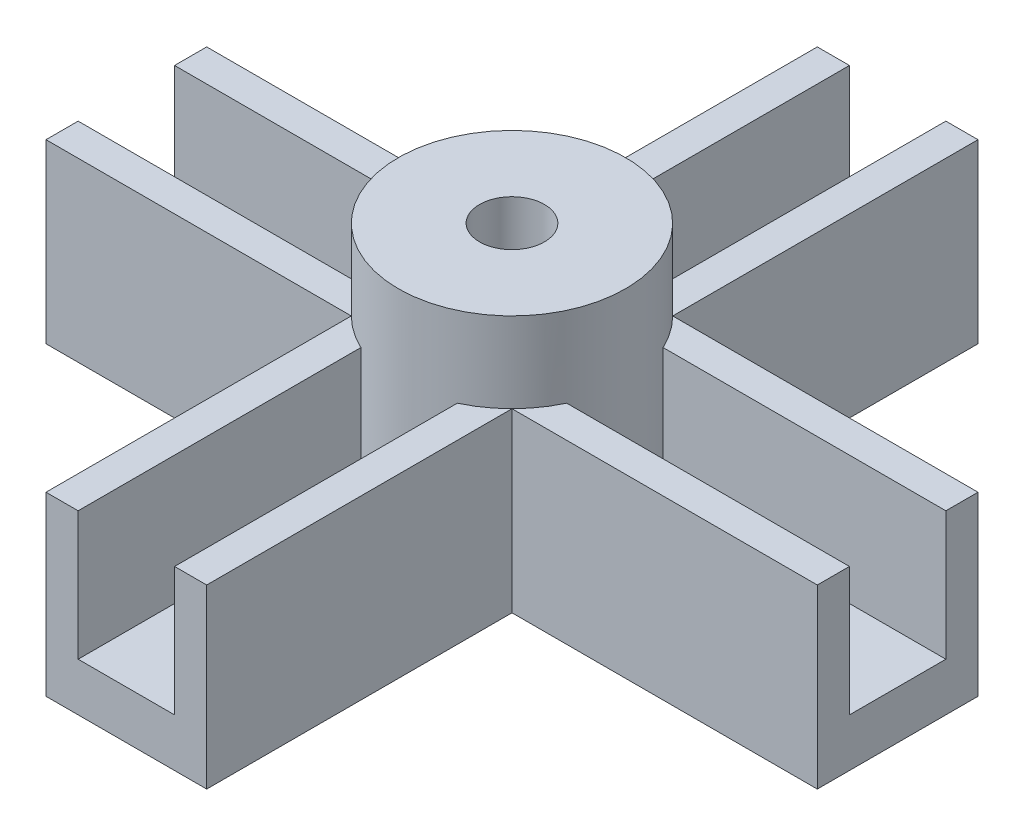
ISO-10303-21;
HEADER;
FILE_DESCRIPTION(('STEP AP214'),'2;1');
FILE_NAME('part.step','',(''),(''),'','','');
FILE_SCHEMA(('AUTOMOTIVE_DESIGN { 1 0 10303 214 1 1 1 1 }'));
ENDSEC;
DATA;
#1=APPLICATION_CONTEXT('core data for automotive mechanical design processes');
#2=APPLICATION_PROTOCOL_DEFINITION('international standard','automotive_design',2000,#1);
#3=PRODUCT_CONTEXT('',#1,'mechanical');
#4=PRODUCT('Part','Part','',(#3));
#5=PRODUCT_RELATED_PRODUCT_CATEGORY('part','',(#4));
#6=PRODUCT_DEFINITION_FORMATION('','',#4);
#7=PRODUCT_DEFINITION_CONTEXT('part definition',#1,'design');
#8=PRODUCT_DEFINITION('design','',#6,#7);
#9=PRODUCT_DEFINITION_SHAPE('','',#8);
#10=(LENGTH_UNIT() NAMED_UNIT(*) SI_UNIT(.MILLI.,.METRE.));
#11=(NAMED_UNIT(*) PLANE_ANGLE_UNIT() SI_UNIT($,.RADIAN.));
#12=(NAMED_UNIT(*) SI_UNIT($,.STERADIAN.) SOLID_ANGLE_UNIT());
#13=UNCERTAINTY_MEASURE_WITH_UNIT(LENGTH_MEASURE(1.E-05),#10,'distance_accuracy_value','');
#14=(GEOMETRIC_REPRESENTATION_CONTEXT(3) GLOBAL_UNCERTAINTY_ASSIGNED_CONTEXT((#13)) GLOBAL_UNIT_ASSIGNED_CONTEXT((#10,
#11,#12)) REPRESENTATION_CONTEXT('',''));
#15=CARTESIAN_POINT('',(0.,0.,0.));
#16=DIRECTION('',(0.,0.,1.));
#17=DIRECTION('',(1.,0.,0.));
#18=AXIS2_PLACEMENT_3D('',#15,#16,#17);
#19=CARTESIAN_POINT('',(0.,40.5305358690022,0.));
#20=DIRECTION('',(0.,-1.,0.));
#21=DIRECTION('',(0.,0.,-1.));
#22=AXIS2_PLACEMENT_3D('',#19,#20,#21);
#23=CYLINDRICAL_SURFACE('',#22,17.6776695296637);
#24=CARTESIAN_POINT('',(0.,40.,0.));
#25=DIRECTION('',(0.,1.,0.));
#26=DIRECTION('',(0.,0.,1.));
#27=AXIS2_PLACEMENT_3D('',#24,#25,#26);
#28=CIRCLE('',#27,17.6776695296637);
#29=CARTESIAN_POINT('',(0.,40.,17.6776695296637));
#30=VERTEX_POINT('',#29);
#31=EDGE_CURVE('E443',#30,#30,#28,.T.);
#32=ORIENTED_EDGE('',*,*,#31,.F.);
#33=EDGE_LOOP('',(#32));
#34=FACE_BOUND('',#33,.T.);
#35=CARTESIAN_POINT('',(0.,7.5,0.));
#36=DIRECTION('',(0.,1.,0.));
#37=DIRECTION('',(0.,0.,1.));
#38=AXIS2_PLACEMENT_3D('',#35,#36,#37);
#39=CIRCLE('',#38,17.6776695296637);
#40=CARTESIAN_POINT('',(-16.0078105935821,7.5,-7.49999999999998));
#41=VERTEX_POINT('',#40);
#42=CARTESIAN_POINT('',(-16.0078105935821,7.5,7.49999999999998));
#43=VERTEX_POINT('',#42);
#44=EDGE_CURVE('E300',#41,#43,#39,.T.);
#45=ORIENTED_EDGE('',*,*,#44,.T.);
#46=DIRECTION('',(0.,-1.,0.));
#47=VECTOR('',#46,1.);
#48=CARTESIAN_POINT('',(-16.0078105935821,27.5,7.49999999999998));
#49=LINE('',#48,#47);
#50=CARTESIAN_POINT('',(-16.0078105935821,27.5,7.49999999999998));
#51=VERTEX_POINT('',#50);
#52=EDGE_CURVE('E284',#51,#43,#49,.T.);
#53=ORIENTED_EDGE('',*,*,#52,.F.);
#54=CARTESIAN_POINT('',(0.,27.5,0.));
#55=DIRECTION('',(0.,1.,0.));
#56=DIRECTION('',(0.,0.,1.));
#57=AXIS2_PLACEMENT_3D('',#54,#55,#56);
#58=CIRCLE('',#57,17.6776695296637);
#59=CARTESIAN_POINT('',(-12.5,27.5,12.5));
#60=VERTEX_POINT('',#59);
#61=EDGE_CURVE('E304',#60,#51,#58,.F.);
#62=ORIENTED_EDGE('',*,*,#61,.F.);
#63=CARTESIAN_POINT('',(0.,27.5,0.));
#64=DIRECTION('',(0.,1.,0.));
#65=DIRECTION('',(0.,0.,1.));
#66=AXIS2_PLACEMENT_3D('',#63,#64,#65);
#67=CIRCLE('',#66,17.6776695296637);
#68=CARTESIAN_POINT('',(-7.49999999999999,27.5,16.0078105935821));
#69=VERTEX_POINT('',#68);
#70=EDGE_CURVE('E608',#60,#69,#67,.T.);
#71=ORIENTED_EDGE('',*,*,#70,.T.);
#72=DIRECTION('',(0.,-1.,0.));
#73=VECTOR('',#72,1.);
#74=CARTESIAN_POINT('',(-7.49999999999999,27.5,16.0078105935821));
#75=LINE('',#74,#73);
#76=CARTESIAN_POINT('',(-7.49999999999999,7.5,16.0078105935821));
#77=VERTEX_POINT('',#76);
#78=EDGE_CURVE('E601',#69,#77,#75,.T.);
#79=ORIENTED_EDGE('',*,*,#78,.T.);
#80=CARTESIAN_POINT('',(0.,7.5,0.));
#81=DIRECTION('',(0.,1.,0.));
#82=DIRECTION('',(0.,0.,1.));
#83=AXIS2_PLACEMENT_3D('',#80,#81,#82);
#84=CIRCLE('',#83,17.6776695296637);
#85=CARTESIAN_POINT('',(7.49999999999988,7.5,16.0078105935822));
#86=VERTEX_POINT('',#85);
#87=EDGE_CURVE('E389',#77,#86,#84,.T.);
#88=ORIENTED_EDGE('',*,*,#87,.T.);
#89=DIRECTION('',(0.,-1.,0.));
#90=VECTOR('',#89,1.);
#91=CARTESIAN_POINT('',(7.49999999999988,27.5,16.0078105935821));
#92=LINE('',#91,#90);
#93=CARTESIAN_POINT('',(7.49999999999989,27.5,16.0078105935821));
#94=VERTEX_POINT('',#93);
#95=EDGE_CURVE('E119',#94,#86,#92,.T.);
#96=ORIENTED_EDGE('',*,*,#95,.F.);
#97=CARTESIAN_POINT('',(0.,27.5,0.));
#98=DIRECTION('',(0.,1.,0.));
#99=DIRECTION('',(0.,0.,1.));
#100=AXIS2_PLACEMENT_3D('',#97,#98,#99);
#101=CIRCLE('',#100,17.6776695296637);
#102=CARTESIAN_POINT('',(12.5,27.5,12.5));
#103=VERTEX_POINT('',#102);
#104=EDGE_CURVE('E575',#94,#103,#101,.T.);
#105=ORIENTED_EDGE('',*,*,#104,.T.);
#106=CARTESIAN_POINT('',(0.,27.5,0.));
#107=DIRECTION('',(0.,1.,0.));
#108=DIRECTION('',(0.,0.,1.));
#109=AXIS2_PLACEMENT_3D('',#106,#107,#108);
#110=CIRCLE('',#109,17.6776695296637);
#111=CARTESIAN_POINT('',(16.0078105935821,27.5,7.49999999999998));
#112=VERTEX_POINT('',#111);
#113=EDGE_CURVE('E563',#103,#112,#110,.T.);
#114=ORIENTED_EDGE('',*,*,#113,.T.);
#115=DIRECTION('',(0.,-1.,0.));
#116=VECTOR('',#115,1.);
#117=CARTESIAN_POINT('',(16.0078105935821,27.5,7.49999999999998));
#118=LINE('',#117,#116);
#119=CARTESIAN_POINT('',(16.0078105935821,7.5,7.49999999999998));
#120=VERTEX_POINT('',#119);
#121=EDGE_CURVE('E555',#112,#120,#118,.T.);
#122=ORIENTED_EDGE('',*,*,#121,.T.);
#123=CARTESIAN_POINT('',(0.,7.5,0.));
#124=DIRECTION('',(0.,1.,0.));
#125=DIRECTION('',(0.,0.,1.));
#126=AXIS2_PLACEMENT_3D('',#123,#124,#125);
#127=CIRCLE('',#126,17.6776695296637);
#128=CARTESIAN_POINT('',(16.0078105935821,7.5,-7.49999999999998));
#129=VERTEX_POINT('',#128);
#130=EDGE_CURVE('E332',#120,#129,#127,.T.);
#131=ORIENTED_EDGE('',*,*,#130,.T.);
#132=DIRECTION('',(0.,-1.,0.));
#133=VECTOR('',#132,1.);
#134=CARTESIAN_POINT('',(16.0078105935821,27.5,-7.49999999999998));
#135=LINE('',#134,#133);
#136=CARTESIAN_POINT('',(16.0078105935821,27.5,-7.49999999999998));
#137=VERTEX_POINT('',#136);
#138=EDGE_CURVE('E537',#137,#129,#135,.T.);
#139=ORIENTED_EDGE('',*,*,#138,.F.);
#140=CARTESIAN_POINT('',(0.,27.5,0.));
#141=DIRECTION('',(0.,1.,0.));
#142=DIRECTION('',(0.,0.,1.));
#143=AXIS2_PLACEMENT_3D('',#140,#141,#142);
#144=CIRCLE('',#143,17.6776695296637);
#145=CARTESIAN_POINT('',(12.5,27.5,-12.5));
#146=VERTEX_POINT('',#145);
#147=EDGE_CURVE('E528',#137,#146,#144,.T.);
#148=ORIENTED_EDGE('',*,*,#147,.T.);
#149=CARTESIAN_POINT('',(0.,27.5,0.));
#150=DIRECTION('',(0.,1.,0.));
#151=DIRECTION('',(0.,0.,1.));
#152=AXIS2_PLACEMENT_3D('',#149,#150,#151);
#153=CIRCLE('',#152,17.6776695296637);
#154=CARTESIAN_POINT('',(7.49999999999988,27.5,-16.0078105935821));
#155=VERTEX_POINT('',#154);
#156=EDGE_CURVE('E514',#146,#155,#153,.T.);
#157=ORIENTED_EDGE('',*,*,#156,.T.);
#158=DIRECTION('',(0.,-1.,0.));
#159=VECTOR('',#158,1.);
#160=CARTESIAN_POINT('',(7.49999999999988,27.5,-16.0078105935821));
#161=LINE('',#160,#159);
#162=CARTESIAN_POINT('',(7.49999999999988,7.5,-16.0078105935821));
#163=VERTEX_POINT('',#162);
#164=EDGE_CURVE('E506',#155,#163,#161,.T.);
#165=ORIENTED_EDGE('',*,*,#164,.T.);
#166=CARTESIAN_POINT('',(0.,7.5,0.));
#167=DIRECTION('',(0.,1.,0.));
#168=DIRECTION('',(0.,0.,1.));
#169=AXIS2_PLACEMENT_3D('',#166,#167,#168);
#170=CIRCLE('',#169,17.6776695296637);
#171=CARTESIAN_POINT('',(-7.49999999999999,7.5,-16.0078105935821));
#172=VERTEX_POINT('',#171);
#173=EDGE_CURVE('E437',#163,#172,#170,.T.);
#174=ORIENTED_EDGE('',*,*,#173,.T.);
#175=DIRECTION('',(0.,-1.,0.));
#176=VECTOR('',#175,1.);
#177=CARTESIAN_POINT('',(-7.49999999999999,27.5,-16.0078105935821));
#178=LINE('',#177,#176);
#179=CARTESIAN_POINT('',(-7.49999999999999,27.5,-16.0078105935821));
#180=VERTEX_POINT('',#179);
#181=EDGE_CURVE('E486',#180,#172,#178,.T.);
#182=ORIENTED_EDGE('',*,*,#181,.F.);
#183=CARTESIAN_POINT('',(0.,27.5,0.));
#184=DIRECTION('',(0.,1.,0.));
#185=DIRECTION('',(0.,0.,1.));
#186=AXIS2_PLACEMENT_3D('',#183,#184,#185);
#187=CIRCLE('',#186,17.6776695296637);
#188=CARTESIAN_POINT('',(-12.5,27.5,-12.5));
#189=VERTEX_POINT('',#188);
#190=EDGE_CURVE('E477',#180,#189,#187,.T.);
#191=ORIENTED_EDGE('',*,*,#190,.T.);
#192=CARTESIAN_POINT('',(0.,27.5,0.));
#193=DIRECTION('',(0.,1.,0.));
#194=DIRECTION('',(0.,0.,1.));
#195=AXIS2_PLACEMENT_3D('',#192,#193,#194);
#196=CIRCLE('',#195,17.6776695296637);
#197=CARTESIAN_POINT('',(-16.0078105935821,27.5,-7.49999999999998));
#198=VERTEX_POINT('',#197);
#199=EDGE_CURVE('E467',#198,#189,#196,.F.);
#200=ORIENTED_EDGE('',*,*,#199,.F.);
#201=DIRECTION('',(0.,-1.,0.));
#202=VECTOR('',#201,1.);
#203=CARTESIAN_POINT('',(-16.0078105935821,27.5,-7.49999999999998));
#204=LINE('',#203,#202);
#205=EDGE_CURVE('E309',#198,#41,#204,.T.);
#206=ORIENTED_EDGE('',*,*,#205,.T.);
#207=EDGE_LOOP('',(#45,#53,#62,#71,#79,#88,#96,#105,#114,#122,#131,#139,#148,#157,#165,#174,
#182,#191,#200,#206));
#208=FACE_BOUND('',#207,.T.);
#209=ADVANCED_FACE('F95',(#34,#208),#23,.T.);
#210=CARTESIAN_POINT('',(0.,7.5,0.));
#211=DIRECTION('',(0.,1.,0.));
#212=DIRECTION('',(0.,0.,1.));
#213=AXIS2_PLACEMENT_3D('',#210,#211,#212);
#214=PLANE('',#213);
#215=ORIENTED_EDGE('',*,*,#87,.F.);
#216=DIRECTION('',(0.,0.,-1.));
#217=VECTOR('',#216,1.);
#218=CARTESIAN_POINT('',(-7.49999999999998,7.5,0.));
#219=LINE('',#218,#217);
#220=CARTESIAN_POINT('',(-7.49999999999999,7.5,60.));
#221=VERTEX_POINT('',#220);
#222=EDGE_CURVE('E303',#221,#77,#219,.T.);
#223=ORIENTED_EDGE('',*,*,#222,.F.);
#224=DIRECTION('',(1.,0.,0.));
#225=VECTOR('',#224,1.);
#226=CARTESIAN_POINT('',(0.,7.5,60.));
#227=LINE('',#226,#225);
#228=CARTESIAN_POINT('',(7.49999999999973,7.5,60.));
#229=VERTEX_POINT('',#228);
#230=EDGE_CURVE('E394',#221,#229,#227,.T.);
#231=ORIENTED_EDGE('',*,*,#230,.T.);
#232=DIRECTION('',(0.,0.,-1.));
#233=VECTOR('',#232,1.);
#234=CARTESIAN_POINT('',(7.49999999999999,7.5,0.));
#235=LINE('',#234,#233);
#236=EDGE_CURVE('E564',#229,#86,#235,.T.);
#237=ORIENTED_EDGE('',*,*,#236,.T.);
#238=EDGE_LOOP('',(#215,#223,#231,#237));
#239=FACE_BOUND('',#238,.T.);
#240=ADVANCED_FACE('F653',(#239),#214,.T.);
#241=CARTESIAN_POINT('',(0.,7.5,0.));
#242=DIRECTION('',(0.,1.,0.));
#243=DIRECTION('',(0.,0.,1.));
#244=AXIS2_PLACEMENT_3D('',#241,#242,#243);
#245=PLANE('',#244);
#246=ORIENTED_EDGE('',*,*,#130,.F.);
#247=DIRECTION('',(-1.,0.,0.));
#248=VECTOR('',#247,1.);
#249=CARTESIAN_POINT('',(0.,7.5,7.49999999999982));
#250=LINE('',#249,#248);
#251=CARTESIAN_POINT('',(60.,7.5,7.5000000000002));
#252=VERTEX_POINT('',#251);
#253=EDGE_CURVE('E560',#252,#120,#250,.T.);
#254=ORIENTED_EDGE('',*,*,#253,.F.);
#255=DIRECTION('',(0.,0.,-1.));
#256=VECTOR('',#255,1.);
#257=CARTESIAN_POINT('',(60.,7.5,0.));
#258=LINE('',#257,#256);
#259=CARTESIAN_POINT('',(60.,7.5,-7.5000000000002));
#260=VERTEX_POINT('',#259);
#261=EDGE_CURVE('E335',#252,#260,#258,.T.);
#262=ORIENTED_EDGE('',*,*,#261,.T.);
#263=DIRECTION('',(-1.,0.,0.));
#264=VECTOR('',#263,1.);
#265=CARTESIAN_POINT('',(0.,7.5,-7.49999999999982));
#266=LINE('',#265,#264);
#267=EDGE_CURVE('E515',#260,#129,#266,.T.);
#268=ORIENTED_EDGE('',*,*,#267,.T.);
#269=EDGE_LOOP('',(#246,#254,#262,#268));
#270=FACE_BOUND('',#269,.T.);
#271=ADVANCED_FACE('F658',(#270),#245,.T.);
#272=CARTESIAN_POINT('',(0.,7.5,0.));
#273=DIRECTION('',(0.,1.,0.));
#274=DIRECTION('',(0.,0.,1.));
#275=AXIS2_PLACEMENT_3D('',#272,#273,#274);
#276=PLANE('',#275);
#277=ORIENTED_EDGE('',*,*,#173,.F.);
#278=DIRECTION('',(0.,0.,1.));
#279=VECTOR('',#278,1.);
#280=CARTESIAN_POINT('',(7.49999999999999,7.5,0.));
#281=LINE('',#280,#279);
#282=CARTESIAN_POINT('',(7.49999999999973,7.5,-60.));
#283=VERTEX_POINT('',#282);
#284=EDGE_CURVE('E511',#283,#163,#281,.T.);
#285=ORIENTED_EDGE('',*,*,#284,.F.);
#286=DIRECTION('',(1.,0.,0.));
#287=VECTOR('',#286,1.);
#288=CARTESIAN_POINT('',(0.,7.5,-60.));
#289=LINE('',#288,#287);
#290=CARTESIAN_POINT('',(-7.49999999999999,7.5,-60.));
#291=VERTEX_POINT('',#290);
#292=EDGE_CURVE('E432',#291,#283,#289,.T.);
#293=ORIENTED_EDGE('',*,*,#292,.F.);
#294=DIRECTION('',(0.,0.,1.));
#295=VECTOR('',#294,1.);
#296=CARTESIAN_POINT('',(-7.49999999999998,7.5,0.));
#297=LINE('',#296,#295);
#298=EDGE_CURVE('E463',#291,#172,#297,.T.);
#299=ORIENTED_EDGE('',*,*,#298,.T.);
#300=EDGE_LOOP('',(#277,#285,#293,#299));
#301=FACE_BOUND('',#300,.T.);
#302=ADVANCED_FACE('F667',(#301),#276,.T.);
#303=CARTESIAN_POINT('',(0.,7.5,0.));
#304=DIRECTION('',(0.,1.,0.));
#305=DIRECTION('',(0.,0.,1.));
#306=AXIS2_PLACEMENT_3D('',#303,#304,#305);
#307=PLANE('',#306);
#308=DIRECTION('',(1.,0.,0.));
#309=VECTOR('',#308,1.);
#310=CARTESIAN_POINT('',(0.,7.5,7.49999999999998));
#311=LINE('',#310,#309);
#312=CARTESIAN_POINT('',(-60.,7.5,7.49999999999998));
#313=VERTEX_POINT('',#312);
#314=EDGE_CURVE('E287',#313,#43,#311,.T.);
#315=ORIENTED_EDGE('',*,*,#314,.T.);
#316=ORIENTED_EDGE('',*,*,#44,.F.);
#317=DIRECTION('',(1.,0.,0.));
#318=VECTOR('',#317,1.);
#319=CARTESIAN_POINT('',(0.,7.5,-7.49999999999998));
#320=LINE('',#319,#318);
#321=CARTESIAN_POINT('',(-60.,7.5,-7.49999999999998));
#322=VERTEX_POINT('',#321);
#323=EDGE_CURVE('E459',#322,#41,#320,.T.);
#324=ORIENTED_EDGE('',*,*,#323,.F.);
#325=DIRECTION('',(0.,0.,-1.));
#326=VECTOR('',#325,1.);
#327=CARTESIAN_POINT('',(-60.,7.5,0.));
#328=LINE('',#327,#326);
#329=EDGE_CURVE('E301',#313,#322,#328,.T.);
#330=ORIENTED_EDGE('',*,*,#329,.F.);
#331=EDGE_LOOP('',(#315,#316,#324,#330));
#332=FACE_BOUND('',#331,.T.);
#333=ADVANCED_FACE('F298',(#332),#307,.T.);
#334=CARTESIAN_POINT('',(0.,7.5,-12.5));
#335=DIRECTION('',(0.,0.,-1.));
#336=DIRECTION('',(-1.,0.,0.));
#337=AXIS2_PLACEMENT_3D('',#334,#335,#336);
#338=PLANE('',#337);
#339=DIRECTION('',(1.,0.,0.));
#340=VECTOR('',#339,1.);
#341=CARTESIAN_POINT('',(0.,0.,-12.5));
#342=LINE('',#341,#340);
#343=CARTESIAN_POINT('',(12.5,0.,-12.5));
#344=VERTEX_POINT('',#343);
#345=CARTESIAN_POINT('',(60.,0.,-12.5));
#346=VERTEX_POINT('',#345);
#347=EDGE_CURVE('E346',#344,#346,#342,.T.);
#348=ORIENTED_EDGE('',*,*,#347,.F.);
#349=DIRECTION('',(0.,-1.,0.));
#350=VECTOR('',#349,1.);
#351=CARTESIAN_POINT('',(12.5,40.5305358690022,-12.5));
#352=LINE('',#351,#350);
#353=EDGE_CURVE('E416',#146,#344,#352,.T.);
#354=ORIENTED_EDGE('',*,*,#353,.F.);
#355=DIRECTION('',(-1.,0.,0.));
#356=VECTOR('',#355,1.);
#357=CARTESIAN_POINT('',(0.,27.5,-12.5));
#358=LINE('',#357,#356);
#359=CARTESIAN_POINT('',(60.,27.5,-12.5));
#360=VERTEX_POINT('',#359);
#361=EDGE_CURVE('E355',#360,#146,#358,.T.);
#362=ORIENTED_EDGE('',*,*,#361,.F.);
#363=DIRECTION('',(0.,-1.,0.));
#364=VECTOR('',#363,1.);
#365=CARTESIAN_POINT('',(60.,7.5,-12.5));
#366=LINE('',#365,#364);
#367=EDGE_CURVE('E104',#360,#346,#366,.T.);
#368=ORIENTED_EDGE('',*,*,#367,.T.);
#369=EDGE_LOOP('',(#348,#354,#362,#368));
#370=FACE_BOUND('',#369,.T.);
#371=ADVANCED_FACE('F352',(#370),#338,.T.);
#372=DIRECTION('',(0.,-1.,0.));
#373=VECTOR('',#372,1.);
#374=CARTESIAN_POINT('',(-60.,7.5,-12.5));
#375=LINE('',#374,#373);
#376=CARTESIAN_POINT('',(-60.,27.5,-12.5));
#377=VERTEX_POINT('',#376);
#378=CARTESIAN_POINT('',(-60.,0.,-12.5));
#379=VERTEX_POINT('',#378);
#380=EDGE_CURVE('E327',#377,#379,#375,.T.);
#381=ORIENTED_EDGE('',*,*,#380,.F.);
#382=DIRECTION('',(-1.,0.,0.));
#383=VECTOR('',#382,1.);
#384=CARTESIAN_POINT('',(0.,27.5,-12.5));
#385=LINE('',#384,#383);
#386=EDGE_CURVE('E458',#189,#377,#385,.T.);
#387=ORIENTED_EDGE('',*,*,#386,.F.);
#388=DIRECTION('',(0.,-1.,0.));
#389=VECTOR('',#388,1.);
#390=CARTESIAN_POINT('',(-12.5,40.5305358690022,-12.5));
#391=LINE('',#390,#389);
#392=CARTESIAN_POINT('',(-12.5,0.,-12.5));
#393=VERTEX_POINT('',#392);
#394=EDGE_CURVE('E418',#189,#393,#391,.T.);
#395=ORIENTED_EDGE('',*,*,#394,.T.);
#396=EDGE_CURVE('E336',#379,#393,#342,.T.);
#397=ORIENTED_EDGE('',*,*,#396,.F.);
#398=EDGE_LOOP('',(#381,#387,#395,#397));
#399=FACE_BOUND('',#398,.T.);
#400=ADVANCED_FACE('F673',(#399),#338,.T.);
#401=CARTESIAN_POINT('',(0.,7.5,12.5));
#402=DIRECTION('',(0.,0.,-1.));
#403=DIRECTION('',(-1.,0.,0.));
#404=AXIS2_PLACEMENT_3D('',#401,#402,#403);
#405=PLANE('',#404);
#406=DIRECTION('',(0.,-1.,0.));
#407=VECTOR('',#406,1.);
#408=CARTESIAN_POINT('',(12.5,40.5305358690022,12.5));
#409=LINE('',#408,#407);
#410=CARTESIAN_POINT('',(12.5,0.,12.5));
#411=VERTEX_POINT('',#410);
#412=EDGE_CURVE('E321',#103,#411,#409,.T.);
#413=ORIENTED_EDGE('',*,*,#412,.T.);
#414=DIRECTION('',(1.,0.,0.));
#415=VECTOR('',#414,1.);
#416=CARTESIAN_POINT('',(0.,0.,12.5));
#417=LINE('',#416,#415);
#418=CARTESIAN_POINT('',(60.,0.,12.5));
#419=VERTEX_POINT('',#418);
#420=EDGE_CURVE('E331',#411,#419,#417,.T.);
#421=ORIENTED_EDGE('',*,*,#420,.T.);
#422=DIRECTION('',(0.,-1.,0.));
#423=VECTOR('',#422,1.);
#424=CARTESIAN_POINT('',(60.,7.5,12.5));
#425=LINE('',#424,#423);
#426=CARTESIAN_POINT('',(60.,27.5,12.5));
#427=VERTEX_POINT('',#426);
#428=EDGE_CURVE('E12',#427,#419,#425,.T.);
#429=ORIENTED_EDGE('',*,*,#428,.F.);
#430=DIRECTION('',(1.,0.,0.));
#431=VECTOR('',#430,1.);
#432=CARTESIAN_POINT('',(0.,27.5,12.5));
#433=LINE('',#432,#431);
#434=EDGE_CURVE('E377',#103,#427,#433,.T.);
#435=ORIENTED_EDGE('',*,*,#434,.F.);
#436=EDGE_LOOP('',(#413,#421,#429,#435));
#437=FACE_BOUND('',#436,.T.);
#438=ADVANCED_FACE('F97',(#437),#405,.F.);
#439=DIRECTION('',(0.,-1.,0.));
#440=VECTOR('',#439,1.);
#441=CARTESIAN_POINT('',(-12.5,40.5305358690022,12.5));
#442=LINE('',#441,#440);
#443=CARTESIAN_POINT('',(-12.5,0.,12.5));
#444=VERTEX_POINT('',#443);
#445=EDGE_CURVE('E318',#60,#444,#442,.T.);
#446=ORIENTED_EDGE('',*,*,#445,.F.);
#447=DIRECTION('',(1.,0.,0.));
#448=VECTOR('',#447,1.);
#449=CARTESIAN_POINT('',(0.,27.5,12.5));
#450=LINE('',#449,#448);
#451=CARTESIAN_POINT('',(-60.,27.5,12.5));
#452=VERTEX_POINT('',#451);
#453=EDGE_CURVE('E626',#452,#60,#450,.T.);
#454=ORIENTED_EDGE('',*,*,#453,.F.);
#455=DIRECTION('',(0.,-1.,0.));
#456=VECTOR('',#455,1.);
#457=CARTESIAN_POINT('',(-60.,7.5,12.5));
#458=LINE('',#457,#456);
#459=CARTESIAN_POINT('',(-60.,0.,12.5));
#460=VERTEX_POINT('',#459);
#461=EDGE_CURVE('E315',#452,#460,#458,.T.);
#462=ORIENTED_EDGE('',*,*,#461,.T.);
#463=EDGE_CURVE('E339',#460,#444,#417,.T.);
#464=ORIENTED_EDGE('',*,*,#463,.T.);
#465=EDGE_LOOP('',(#446,#454,#462,#464));
#466=FACE_BOUND('',#465,.T.);
#467=ADVANCED_FACE('F675',(#466),#405,.F.);
#468=CARTESIAN_POINT('',(60.,7.5,0.));
#469=DIRECTION('',(-1.,0.,0.));
#470=DIRECTION('',(0.,0.,1.));
#471=AXIS2_PLACEMENT_3D('',#468,#469,#470);
#472=PLANE('',#471);
#473=DIRECTION('',(0.,0.,-1.));
#474=VECTOR('',#473,1.);
#475=CARTESIAN_POINT('',(60.,0.,0.));
#476=LINE('',#475,#474);
#477=EDGE_CURVE('E342',#419,#346,#476,.T.);
#478=ORIENTED_EDGE('',*,*,#477,.T.);
#479=ORIENTED_EDGE('',*,*,#367,.F.);
#480=DIRECTION('',(0.,0.,-1.));
#481=VECTOR('',#480,1.);
#482=CARTESIAN_POINT('',(60.,27.5,0.));
#483=LINE('',#482,#481);
#484=CARTESIAN_POINT('',(60.,27.5,-7.5000000000002));
#485=VERTEX_POINT('',#484);
#486=EDGE_CURVE('E538',#485,#360,#483,.T.);
#487=ORIENTED_EDGE('',*,*,#486,.F.);
#488=DIRECTION('',(0.,-1.,0.));
#489=VECTOR('',#488,1.);
#490=CARTESIAN_POINT('',(60.,27.5,-7.5000000000002));
#491=LINE('',#490,#489);
#492=EDGE_CURVE('E541',#485,#260,#491,.T.);
#493=ORIENTED_EDGE('',*,*,#492,.T.);
#494=ORIENTED_EDGE('',*,*,#261,.F.);
#495=DIRECTION('',(0.,-1.,0.));
#496=VECTOR('',#495,1.);
#497=CARTESIAN_POINT('',(60.,27.5,7.5000000000002));
#498=LINE('',#497,#496);
#499=CARTESIAN_POINT('',(60.,27.5,7.5000000000002));
#500=VERTEX_POINT('',#499);
#501=EDGE_CURVE('E533',#500,#252,#498,.T.);
#502=ORIENTED_EDGE('',*,*,#501,.F.);
#503=DIRECTION('',(0.,0.,-1.));
#504=VECTOR('',#503,1.);
#505=CARTESIAN_POINT('',(60.,27.5,0.));
#506=LINE('',#505,#504);
#507=EDGE_CURVE('E567',#427,#500,#506,.T.);
#508=ORIENTED_EDGE('',*,*,#507,.F.);
#509=ORIENTED_EDGE('',*,*,#428,.T.);
#510=EDGE_LOOP('',(#478,#479,#487,#493,#494,#502,#508,#509));
#511=FACE_BOUND('',#510,.T.);
#512=ADVANCED_FACE('F360',(#511),#472,.F.);
#513=CARTESIAN_POINT('',(0.,0.,0.));
#514=DIRECTION('',(0.,1.,0.));
#515=DIRECTION('',(0.,0.,1.));
#516=AXIS2_PLACEMENT_3D('',#513,#514,#515);
#517=PLANE('',#516);
#518=CARTESIAN_POINT('',(0.,0.,0.));
#519=DIRECTION('',(0.,1.,0.));
#520=DIRECTION('',(0.,0.,1.));
#521=AXIS2_PLACEMENT_3D('',#518,#519,#520);
#522=CIRCLE('',#521,5.05);
#523=CARTESIAN_POINT('',(0.,0.,5.05));
#524=VERTEX_POINT('',#523);
#525=EDGE_CURVE('E621',#524,#524,#522,.F.);
#526=ORIENTED_EDGE('',*,*,#525,.F.);
#527=EDGE_LOOP('',(#526));
#528=FACE_BOUND('',#527,.T.);
#529=DIRECTION('',(0.,0.,-1.));
#530=VECTOR('',#529,1.);
#531=CARTESIAN_POINT('',(-12.5,0.,0.));
#532=LINE('',#531,#530);
#533=CARTESIAN_POINT('',(-12.5,0.,60.));
#534=VERTEX_POINT('',#533);
#535=EDGE_CURVE('E396',#534,#444,#532,.T.);
#536=ORIENTED_EDGE('',*,*,#535,.T.);
#537=ORIENTED_EDGE('',*,*,#463,.F.);
#538=DIRECTION('',(0.,0.,-1.));
#539=VECTOR('',#538,1.);
#540=CARTESIAN_POINT('',(-60.,0.,0.));
#541=LINE('',#540,#539);
#542=EDGE_CURVE('E311',#460,#379,#541,.T.);
#543=ORIENTED_EDGE('',*,*,#542,.T.);
#544=ORIENTED_EDGE('',*,*,#396,.T.);
#545=DIRECTION('',(0.,0.,-1.));
#546=VECTOR('',#545,1.);
#547=CARTESIAN_POINT('',(-12.5,0.,0.));
#548=LINE('',#547,#546);
#549=CARTESIAN_POINT('',(-12.5,0.,-60.));
#550=VERTEX_POINT('',#549);
#551=EDGE_CURVE('E433',#393,#550,#548,.T.);
#552=ORIENTED_EDGE('',*,*,#551,.T.);
#553=DIRECTION('',(1.,0.,0.));
#554=VECTOR('',#553,1.);
#555=CARTESIAN_POINT('',(0.,0.,-60.));
#556=LINE('',#555,#554);
#557=CARTESIAN_POINT('',(12.5,0.,-60.));
#558=VERTEX_POINT('',#557);
#559=EDGE_CURVE('E438',#550,#558,#556,.T.);
#560=ORIENTED_EDGE('',*,*,#559,.T.);
#561=DIRECTION('',(0.,0.,-1.));
#562=VECTOR('',#561,1.);
#563=CARTESIAN_POINT('',(12.5,0.,0.));
#564=LINE('',#563,#562);
#565=EDGE_CURVE('E370',#344,#558,#564,.T.);
#566=ORIENTED_EDGE('',*,*,#565,.F.);
#567=ORIENTED_EDGE('',*,*,#347,.T.);
#568=ORIENTED_EDGE('',*,*,#477,.F.);
#569=ORIENTED_EDGE('',*,*,#420,.F.);
#570=DIRECTION('',(0.,0.,-1.));
#571=VECTOR('',#570,1.);
#572=CARTESIAN_POINT('',(12.5,0.,0.));
#573=LINE('',#572,#571);
#574=CARTESIAN_POINT('',(12.5,0.,60.));
#575=VERTEX_POINT('',#574);
#576=EDGE_CURVE('E384',#575,#411,#573,.T.);
#577=ORIENTED_EDGE('',*,*,#576,.F.);
#578=DIRECTION('',(1.,0.,0.));
#579=VECTOR('',#578,1.);
#580=CARTESIAN_POINT('',(0.,0.,60.));
#581=LINE('',#580,#579);
#582=EDGE_CURVE('E390',#534,#575,#581,.T.);
#583=ORIENTED_EDGE('',*,*,#582,.F.);
#584=EDGE_LOOP('',(#536,#537,#543,#544,#552,#560,#566,#567,#568,#569,#577,#583));
#585=FACE_BOUND('',#584,.T.);
#586=ADVANCED_FACE('F364',(#528,#585),#517,.F.);
#587=CARTESIAN_POINT('',(-60.,7.5,0.));
#588=DIRECTION('',(-1.,0.,0.));
#589=DIRECTION('',(0.,0.,1.));
#590=AXIS2_PLACEMENT_3D('',#587,#588,#589);
#591=PLANE('',#590);
#592=ORIENTED_EDGE('',*,*,#542,.F.);
#593=ORIENTED_EDGE('',*,*,#461,.F.);
#594=DIRECTION('',(0.,0.,1.));
#595=VECTOR('',#594,1.);
#596=CARTESIAN_POINT('',(-60.,27.5,0.));
#597=LINE('',#596,#595);
#598=CARTESIAN_POINT('',(-60.,27.5,7.49999999999998));
#599=VERTEX_POINT('',#598);
#600=EDGE_CURVE('E622',#599,#452,#597,.T.);
#601=ORIENTED_EDGE('',*,*,#600,.F.);
#602=DIRECTION('',(0.,-1.,0.));
#603=VECTOR('',#602,1.);
#604=CARTESIAN_POINT('',(-60.,27.5,7.49999999999998));
#605=LINE('',#604,#603);
#606=EDGE_CURVE('E294',#599,#313,#605,.T.);
#607=ORIENTED_EDGE('',*,*,#606,.T.);
#608=ORIENTED_EDGE('',*,*,#329,.T.);
#609=DIRECTION('',(0.,-1.,0.));
#610=VECTOR('',#609,1.);
#611=CARTESIAN_POINT('',(-60.,27.5,-7.49999999999998));
#612=LINE('',#611,#610);
#613=CARTESIAN_POINT('',(-60.,27.5,-7.49999999999998));
#614=VERTEX_POINT('',#613);
#615=EDGE_CURVE('E452',#614,#322,#612,.T.);
#616=ORIENTED_EDGE('',*,*,#615,.F.);
#617=DIRECTION('',(0.,0.,1.));
#618=VECTOR('',#617,1.);
#619=CARTESIAN_POINT('',(-60.,27.5,0.));
#620=LINE('',#619,#618);
#621=EDGE_CURVE('E462',#377,#614,#620,.T.);
#622=ORIENTED_EDGE('',*,*,#621,.F.);
#623=ORIENTED_EDGE('',*,*,#380,.T.);
#624=EDGE_LOOP('',(#592,#593,#601,#607,#608,#616,#622,#623));
#625=FACE_BOUND('',#624,.T.);
#626=ADVANCED_FACE('F663',(#625),#591,.T.);
#627=CARTESIAN_POINT('',(-12.5,7.5,0.));
#628=DIRECTION('',(-1.,0.,0.));
#629=DIRECTION('',(0.,0.,1.));
#630=AXIS2_PLACEMENT_3D('',#627,#628,#629);
#631=PLANE('',#630);
#632=ORIENTED_EDGE('',*,*,#535,.F.);
#633=DIRECTION('',(0.,-1.,0.));
#634=VECTOR('',#633,1.);
#635=CARTESIAN_POINT('',(-12.5,7.5,60.));
#636=LINE('',#635,#634);
#637=CARTESIAN_POINT('',(-12.5,27.5,60.));
#638=VERTEX_POINT('',#637);
#639=EDGE_CURVE('E382',#638,#534,#636,.T.);
#640=ORIENTED_EDGE('',*,*,#639,.F.);
#641=DIRECTION('',(0.,0.,1.));
#642=VECTOR('',#641,1.);
#643=CARTESIAN_POINT('',(-12.5,27.5,0.));
#644=LINE('',#643,#642);
#645=EDGE_CURVE('E410',#60,#638,#644,.T.);
#646=ORIENTED_EDGE('',*,*,#645,.F.);
#647=ORIENTED_EDGE('',*,*,#445,.T.);
#648=EDGE_LOOP('',(#632,#640,#646,#647));
#649=FACE_BOUND('',#648,.T.);
#650=ADVANCED_FACE('F408',(#649),#631,.T.);
#651=CARTESIAN_POINT('',(0.,7.5,60.));
#652=DIRECTION('',(0.,0.,-1.));
#653=DIRECTION('',(-1.,0.,0.));
#654=AXIS2_PLACEMENT_3D('',#651,#652,#653);
#655=PLANE('',#654);
#656=ORIENTED_EDGE('',*,*,#582,.T.);
#657=DIRECTION('',(0.,-1.,0.));
#658=VECTOR('',#657,1.);
#659=CARTESIAN_POINT('',(12.5,7.5,60.));
#660=LINE('',#659,#658);
#661=CARTESIAN_POINT('',(12.5,27.5,60.));
#662=VERTEX_POINT('',#661);
#663=EDGE_CURVE('E386',#662,#575,#660,.T.);
#664=ORIENTED_EDGE('',*,*,#663,.F.);
#665=DIRECTION('',(1.,0.,0.));
#666=VECTOR('',#665,1.);
#667=CARTESIAN_POINT('',(0.,27.5,60.));
#668=LINE('',#667,#666);
#669=CARTESIAN_POINT('',(7.49999999999973,27.5,60.));
#670=VERTEX_POINT('',#669);
#671=EDGE_CURVE('E582',#670,#662,#668,.T.);
#672=ORIENTED_EDGE('',*,*,#671,.F.);
#673=DIRECTION('',(0.,-1.,0.));
#674=VECTOR('',#673,1.);
#675=CARTESIAN_POINT('',(7.49999999999973,27.5,60.));
#676=LINE('',#675,#674);
#677=EDGE_CURVE('E587',#670,#229,#676,.T.);
#678=ORIENTED_EDGE('',*,*,#677,.T.);
#679=ORIENTED_EDGE('',*,*,#230,.F.);
#680=DIRECTION('',(0.,-1.,0.));
#681=VECTOR('',#680,1.);
#682=CARTESIAN_POINT('',(-7.49999999999999,27.5,60.));
#683=LINE('',#682,#681);
#684=CARTESIAN_POINT('',(-7.49999999999999,27.5,60.));
#685=VERTEX_POINT('',#684);
#686=EDGE_CURVE('E111',#685,#221,#683,.T.);
#687=ORIENTED_EDGE('',*,*,#686,.F.);
#688=DIRECTION('',(1.,0.,0.));
#689=VECTOR('',#688,1.);
#690=CARTESIAN_POINT('',(0.,27.5,60.));
#691=LINE('',#690,#689);
#692=EDGE_CURVE('E611',#638,#685,#691,.T.);
#693=ORIENTED_EDGE('',*,*,#692,.F.);
#694=ORIENTED_EDGE('',*,*,#639,.T.);
#695=EDGE_LOOP('',(#656,#664,#672,#678,#679,#687,#693,#694));
#696=FACE_BOUND('',#695,.T.);
#697=ADVANCED_FACE('F723',(#696),#655,.F.);
#698=CARTESIAN_POINT('',(12.5,7.5,0.));
#699=DIRECTION('',(-1.,0.,0.));
#700=DIRECTION('',(0.,0.,1.));
#701=AXIS2_PLACEMENT_3D('',#698,#699,#700);
#702=PLANE('',#701);
#703=ORIENTED_EDGE('',*,*,#576,.T.);
#704=ORIENTED_EDGE('',*,*,#412,.F.);
#705=DIRECTION('',(0.,0.,-1.));
#706=VECTOR('',#705,1.);
#707=CARTESIAN_POINT('',(12.5,27.5,0.));
#708=LINE('',#707,#706);
#709=EDGE_CURVE('E586',#662,#103,#708,.T.);
#710=ORIENTED_EDGE('',*,*,#709,.F.);
#711=ORIENTED_EDGE('',*,*,#663,.T.);
#712=EDGE_LOOP('',(#703,#704,#710,#711));
#713=FACE_BOUND('',#712,.T.);
#714=ADVANCED_FACE('F385',(#713),#702,.F.);
#715=CARTESIAN_POINT('',(12.5,7.5,0.));
#716=DIRECTION('',(-1.,0.,0.));
#717=DIRECTION('',(0.,0.,1.));
#718=AXIS2_PLACEMENT_3D('',#715,#716,#717);
#719=PLANE('',#718);
#720=ORIENTED_EDGE('',*,*,#565,.T.);
#721=DIRECTION('',(0.,-1.,0.));
#722=VECTOR('',#721,1.);
#723=CARTESIAN_POINT('',(12.5,7.5,-60.));
#724=LINE('',#723,#722);
#725=CARTESIAN_POINT('',(12.5,27.5,-60.));
#726=VERTEX_POINT('',#725);
#727=EDGE_CURVE('E425',#726,#558,#724,.T.);
#728=ORIENTED_EDGE('',*,*,#727,.F.);
#729=DIRECTION('',(0.,0.,-1.));
#730=VECTOR('',#729,1.);
#731=CARTESIAN_POINT('',(12.5,27.5,0.));
#732=LINE('',#731,#730);
#733=EDGE_CURVE('E521',#146,#726,#732,.T.);
#734=ORIENTED_EDGE('',*,*,#733,.F.);
#735=ORIENTED_EDGE('',*,*,#353,.T.);
#736=EDGE_LOOP('',(#720,#728,#734,#735));
#737=FACE_BOUND('',#736,.T.);
#738=ADVANCED_FACE('F750',(#737),#719,.F.);
#739=CARTESIAN_POINT('',(0.,7.5,-60.));
#740=DIRECTION('',(0.,0.,-1.));
#741=DIRECTION('',(-1.,0.,0.));
#742=AXIS2_PLACEMENT_3D('',#739,#740,#741);
#743=PLANE('',#742);
#744=ORIENTED_EDGE('',*,*,#559,.F.);
#745=DIRECTION('',(0.,-1.,0.));
#746=VECTOR('',#745,1.);
#747=CARTESIAN_POINT('',(-12.5,7.5,-60.));
#748=LINE('',#747,#746);
#749=CARTESIAN_POINT('',(-12.5,27.5,-60.));
#750=VERTEX_POINT('',#749);
#751=EDGE_CURVE('E429',#750,#550,#748,.T.);
#752=ORIENTED_EDGE('',*,*,#751,.F.);
#753=DIRECTION('',(-1.,0.,0.));
#754=VECTOR('',#753,1.);
#755=CARTESIAN_POINT('',(0.,27.5,-60.));
#756=LINE('',#755,#754);
#757=CARTESIAN_POINT('',(-7.49999999999999,27.5,-60.));
#758=VERTEX_POINT('',#757);
#759=EDGE_CURVE('E487',#758,#750,#756,.T.);
#760=ORIENTED_EDGE('',*,*,#759,.F.);
#761=DIRECTION('',(0.,-1.,0.));
#762=VECTOR('',#761,1.);
#763=CARTESIAN_POINT('',(-7.49999999999999,27.5,-60.));
#764=LINE('',#763,#762);
#765=EDGE_CURVE('E492',#758,#291,#764,.T.);
#766=ORIENTED_EDGE('',*,*,#765,.T.);
#767=ORIENTED_EDGE('',*,*,#292,.T.);
#768=DIRECTION('',(0.,-1.,0.));
#769=VECTOR('',#768,1.);
#770=CARTESIAN_POINT('',(7.49999999999973,27.5,-60.));
#771=LINE('',#770,#769);
#772=CARTESIAN_POINT('',(7.49999999999973,27.5,-60.));
#773=VERTEX_POINT('',#772);
#774=EDGE_CURVE('E482',#773,#283,#771,.T.);
#775=ORIENTED_EDGE('',*,*,#774,.F.);
#776=DIRECTION('',(-1.,0.,0.));
#777=VECTOR('',#776,1.);
#778=CARTESIAN_POINT('',(0.,27.5,-60.));
#779=LINE('',#778,#777);
#780=EDGE_CURVE('E518',#726,#773,#779,.T.);
#781=ORIENTED_EDGE('',*,*,#780,.F.);
#782=ORIENTED_EDGE('',*,*,#727,.T.);
#783=EDGE_LOOP('',(#744,#752,#760,#766,#767,#775,#781,#782));
#784=FACE_BOUND('',#783,.T.);
#785=ADVANCED_FACE('F709',(#784),#743,.T.);
#786=CARTESIAN_POINT('',(-12.5,7.5,0.));
#787=DIRECTION('',(-1.,0.,0.));
#788=DIRECTION('',(0.,0.,1.));
#789=AXIS2_PLACEMENT_3D('',#786,#787,#788);
#790=PLANE('',#789);
#791=ORIENTED_EDGE('',*,*,#551,.F.);
#792=ORIENTED_EDGE('',*,*,#394,.F.);
#793=DIRECTION('',(0.,0.,1.));
#794=VECTOR('',#793,1.);
#795=CARTESIAN_POINT('',(-12.5,27.5,0.));
#796=LINE('',#795,#794);
#797=EDGE_CURVE('E491',#750,#189,#796,.T.);
#798=ORIENTED_EDGE('',*,*,#797,.F.);
#799=ORIENTED_EDGE('',*,*,#751,.T.);
#800=EDGE_LOOP('',(#791,#792,#798,#799));
#801=FACE_BOUND('',#800,.T.);
#802=ADVANCED_FACE('F648',(#801),#790,.T.);
#803=CARTESIAN_POINT('',(0.,40.,0.));
#804=DIRECTION('',(0.,1.,0.));
#805=DIRECTION('',(0.,0.,1.));
#806=AXIS2_PLACEMENT_3D('',#803,#804,#805);
#807=PLANE('',#806);
#808=CARTESIAN_POINT('',(0.,40.,0.));
#809=DIRECTION('',(0.,1.,0.));
#810=DIRECTION('',(0.,0.,1.));
#811=AXIS2_PLACEMENT_3D('',#808,#809,#810);
#812=CIRCLE('',#811,5.05);
#813=CARTESIAN_POINT('',(0.,40.,5.05));
#814=VERTEX_POINT('',#813);
#815=EDGE_CURVE('E636',#814,#814,#812,.T.);
#816=ORIENTED_EDGE('',*,*,#815,.F.);
#817=EDGE_LOOP('',(#816));
#818=FACE_BOUND('',#817,.T.);
#819=ORIENTED_EDGE('',*,*,#31,.T.);
#820=EDGE_LOOP('',(#819));
#821=FACE_BOUND('',#820,.T.);
#822=ADVANCED_FACE('F644',(#818,#821),#807,.T.);
#823=CARTESIAN_POINT('',(0.,27.5,-7.49999999999998));
#824=DIRECTION('',(0.,0.,-1.));
#825=DIRECTION('',(-1.,0.,0.));
#826=AXIS2_PLACEMENT_3D('',#823,#824,#825);
#827=PLANE('',#826);
#828=ORIENTED_EDGE('',*,*,#323,.T.);
#829=ORIENTED_EDGE('',*,*,#205,.F.);
#830=DIRECTION('',(1.,0.,0.));
#831=VECTOR('',#830,1.);
#832=CARTESIAN_POINT('',(0.,27.5,-7.49999999999998));
#833=LINE('',#832,#831);
#834=EDGE_CURVE('E471',#614,#198,#833,.T.);
#835=ORIENTED_EDGE('',*,*,#834,.F.);
#836=ORIENTED_EDGE('',*,*,#615,.T.);
#837=EDGE_LOOP('',(#828,#829,#835,#836));
#838=FACE_BOUND('',#837,.T.);
#839=ADVANCED_FACE('F647',(#838),#827,.F.);
#840=CARTESIAN_POINT('',(0.,27.5,0.));
#841=DIRECTION('',(0.,1.,0.));
#842=DIRECTION('',(0.,0.,1.));
#843=AXIS2_PLACEMENT_3D('',#840,#841,#842);
#844=PLANE('',#843);
#845=ORIENTED_EDGE('',*,*,#621,.T.);
#846=ORIENTED_EDGE('',*,*,#834,.T.);
#847=ORIENTED_EDGE('',*,*,#199,.T.);
#848=ORIENTED_EDGE('',*,*,#386,.T.);
#849=EDGE_LOOP('',(#845,#846,#847,#848));
#850=FACE_BOUND('',#849,.T.);
#851=ADVANCED_FACE('F694',(#850),#844,.T.);
#852=CARTESIAN_POINT('',(-7.49999999999998,27.5,0.));
#853=DIRECTION('',(1.,0.,0.));
#854=DIRECTION('',(0.,0.,-1.));
#855=AXIS2_PLACEMENT_3D('',#852,#853,#854);
#856=PLANE('',#855);
#857=ORIENTED_EDGE('',*,*,#298,.F.);
#858=ORIENTED_EDGE('',*,*,#765,.F.);
#859=DIRECTION('',(0.,0.,1.));
#860=VECTOR('',#859,1.);
#861=CARTESIAN_POINT('',(-7.49999999999998,27.5,0.));
#862=LINE('',#861,#860);
#863=EDGE_CURVE('E481',#758,#180,#862,.T.);
#864=ORIENTED_EDGE('',*,*,#863,.T.);
#865=ORIENTED_EDGE('',*,*,#181,.T.);
#866=EDGE_LOOP('',(#857,#858,#864,#865));
#867=FACE_BOUND('',#866,.T.);
#868=ADVANCED_FACE('F704',(#867),#856,.T.);
#869=CARTESIAN_POINT('',(0.,27.5,0.));
#870=DIRECTION('',(0.,1.,0.));
#871=DIRECTION('',(0.,0.,1.));
#872=AXIS2_PLACEMENT_3D('',#869,#870,#871);
#873=PLANE('',#872);
#874=ORIENTED_EDGE('',*,*,#190,.F.);
#875=ORIENTED_EDGE('',*,*,#863,.F.);
#876=ORIENTED_EDGE('',*,*,#759,.T.);
#877=ORIENTED_EDGE('',*,*,#797,.T.);
#878=EDGE_LOOP('',(#874,#875,#876,#877));
#879=FACE_BOUND('',#878,.T.);
#880=ADVANCED_FACE('F700',(#879),#873,.T.);
#881=CARTESIAN_POINT('',(7.49999999999999,27.5,0.));
#882=DIRECTION('',(1.,0.,0.));
#883=DIRECTION('',(0.,0.,-1.));
#884=AXIS2_PLACEMENT_3D('',#881,#882,#883);
#885=PLANE('',#884);
#886=ORIENTED_EDGE('',*,*,#284,.T.);
#887=ORIENTED_EDGE('',*,*,#164,.F.);
#888=DIRECTION('',(0.,0.,1.));
#889=VECTOR('',#888,1.);
#890=CARTESIAN_POINT('',(7.49999999999999,27.5,0.));
#891=LINE('',#890,#889);
#892=EDGE_CURVE('E510',#773,#155,#891,.T.);
#893=ORIENTED_EDGE('',*,*,#892,.F.);
#894=ORIENTED_EDGE('',*,*,#774,.T.);
#895=EDGE_LOOP('',(#886,#887,#893,#894));
#896=FACE_BOUND('',#895,.T.);
#897=ADVANCED_FACE('F758',(#896),#885,.F.);
#898=CARTESIAN_POINT('',(0.,27.5,0.));
#899=DIRECTION('',(0.,1.,0.));
#900=DIRECTION('',(0.,0.,1.));
#901=AXIS2_PLACEMENT_3D('',#898,#899,#900);
#902=PLANE('',#901);
#903=ORIENTED_EDGE('',*,*,#156,.F.);
#904=ORIENTED_EDGE('',*,*,#733,.T.);
#905=ORIENTED_EDGE('',*,*,#780,.T.);
#906=ORIENTED_EDGE('',*,*,#892,.T.);
#907=EDGE_LOOP('',(#903,#904,#905,#906));
#908=FACE_BOUND('',#907,.T.);
#909=ADVANCED_FACE('F753',(#908),#902,.T.);
#910=CARTESIAN_POINT('',(0.,27.5,-7.49999999999982));
#911=DIRECTION('',(0.,0.,1.));
#912=DIRECTION('',(1.,0.,0.));
#913=AXIS2_PLACEMENT_3D('',#910,#911,#912);
#914=PLANE('',#913);
#915=ORIENTED_EDGE('',*,*,#267,.F.);
#916=ORIENTED_EDGE('',*,*,#492,.F.);
#917=DIRECTION('',(-1.,0.,0.));
#918=VECTOR('',#917,1.);
#919=CARTESIAN_POINT('',(0.,27.5,-7.49999999999982));
#920=LINE('',#919,#918);
#921=EDGE_CURVE('E532',#485,#137,#920,.T.);
#922=ORIENTED_EDGE('',*,*,#921,.T.);
#923=ORIENTED_EDGE('',*,*,#138,.T.);
#924=EDGE_LOOP('',(#915,#916,#922,#923));
#925=FACE_BOUND('',#924,.T.);
#926=ADVANCED_FACE('F744',(#925),#914,.T.);
#927=CARTESIAN_POINT('',(0.,27.5,0.));
#928=DIRECTION('',(0.,1.,0.));
#929=DIRECTION('',(0.,0.,1.));
#930=AXIS2_PLACEMENT_3D('',#927,#928,#929);
#931=PLANE('',#930);
#932=ORIENTED_EDGE('',*,*,#147,.F.);
#933=ORIENTED_EDGE('',*,*,#921,.F.);
#934=ORIENTED_EDGE('',*,*,#486,.T.);
#935=ORIENTED_EDGE('',*,*,#361,.T.);
#936=EDGE_LOOP('',(#932,#933,#934,#935));
#937=FACE_BOUND('',#936,.T.);
#938=ADVANCED_FACE('F894',(#937),#931,.T.);
#939=CARTESIAN_POINT('',(0.,27.5,7.49999999999982));
#940=DIRECTION('',(0.,0.,1.));
#941=DIRECTION('',(1.,0.,0.));
#942=AXIS2_PLACEMENT_3D('',#939,#940,#941);
#943=PLANE('',#942);
#944=ORIENTED_EDGE('',*,*,#253,.T.);
#945=ORIENTED_EDGE('',*,*,#121,.F.);
#946=DIRECTION('',(-1.,0.,0.));
#947=VECTOR('',#946,1.);
#948=CARTESIAN_POINT('',(0.,27.5,7.49999999999982));
#949=LINE('',#948,#947);
#950=EDGE_CURVE('E559',#500,#112,#949,.T.);
#951=ORIENTED_EDGE('',*,*,#950,.F.);
#952=ORIENTED_EDGE('',*,*,#501,.T.);
#953=EDGE_LOOP('',(#944,#945,#951,#952));
#954=FACE_BOUND('',#953,.T.);
#955=ADVANCED_FACE('F738',(#954),#943,.F.);
#956=CARTESIAN_POINT('',(0.,27.5,0.));
#957=DIRECTION('',(0.,1.,0.));
#958=DIRECTION('',(0.,0.,1.));
#959=AXIS2_PLACEMENT_3D('',#956,#957,#958);
#960=PLANE('',#959);
#961=ORIENTED_EDGE('',*,*,#113,.F.);
#962=ORIENTED_EDGE('',*,*,#434,.T.);
#963=ORIENTED_EDGE('',*,*,#507,.T.);
#964=ORIENTED_EDGE('',*,*,#950,.T.);
#965=EDGE_LOOP('',(#961,#962,#963,#964));
#966=FACE_BOUND('',#965,.T.);
#967=ADVANCED_FACE('F734',(#966),#960,.T.);
#968=CARTESIAN_POINT('',(7.49999999999999,27.5,0.));
#969=DIRECTION('',(-1.,0.,0.));
#970=DIRECTION('',(0.,0.,1.));
#971=AXIS2_PLACEMENT_3D('',#968,#969,#970);
#972=PLANE('',#971);
#973=ORIENTED_EDGE('',*,*,#236,.F.);
#974=ORIENTED_EDGE('',*,*,#677,.F.);
#975=DIRECTION('',(0.,0.,-1.));
#976=VECTOR('',#975,1.);
#977=CARTESIAN_POINT('',(7.49999999999999,27.5,0.));
#978=LINE('',#977,#976);
#979=EDGE_CURVE('E578',#670,#94,#978,.T.);
#980=ORIENTED_EDGE('',*,*,#979,.T.);
#981=ORIENTED_EDGE('',*,*,#95,.T.);
#982=EDGE_LOOP('',(#973,#974,#980,#981));
#983=FACE_BOUND('',#982,.T.);
#984=ADVANCED_FACE('F728',(#983),#972,.T.);
#985=CARTESIAN_POINT('',(0.,27.5,0.));
#986=DIRECTION('',(0.,1.,0.));
#987=DIRECTION('',(0.,0.,1.));
#988=AXIS2_PLACEMENT_3D('',#985,#986,#987);
#989=PLANE('',#988);
#990=ORIENTED_EDGE('',*,*,#104,.F.);
#991=ORIENTED_EDGE('',*,*,#979,.F.);
#992=ORIENTED_EDGE('',*,*,#671,.T.);
#993=ORIENTED_EDGE('',*,*,#709,.T.);
#994=EDGE_LOOP('',(#990,#991,#992,#993));
#995=FACE_BOUND('',#994,.T.);
#996=ADVANCED_FACE('F730',(#995),#989,.T.);
#997=CARTESIAN_POINT('',(-7.49999999999998,27.5,0.));
#998=DIRECTION('',(-1.,0.,0.));
#999=DIRECTION('',(0.,0.,1.));
#1000=AXIS2_PLACEMENT_3D('',#997,#998,#999);
#1001=PLANE('',#1000);
#1002=ORIENTED_EDGE('',*,*,#222,.T.);
#1003=ORIENTED_EDGE('',*,*,#78,.F.);
#1004=DIRECTION('',(0.,0.,-1.));
#1005=VECTOR('',#1004,1.);
#1006=CARTESIAN_POINT('',(-7.49999999999998,27.5,0.));
#1007=LINE('',#1006,#1005);
#1008=EDGE_CURVE('E605',#685,#69,#1007,.T.);
#1009=ORIENTED_EDGE('',*,*,#1008,.F.);
#1010=ORIENTED_EDGE('',*,*,#686,.T.);
#1011=EDGE_LOOP('',(#1002,#1003,#1009,#1010));
#1012=FACE_BOUND('',#1011,.T.);
#1013=ADVANCED_FACE('F720',(#1012),#1001,.F.);
#1014=CARTESIAN_POINT('',(0.,27.5,0.));
#1015=DIRECTION('',(0.,1.,0.));
#1016=DIRECTION('',(0.,0.,1.));
#1017=AXIS2_PLACEMENT_3D('',#1014,#1015,#1016);
#1018=PLANE('',#1017);
#1019=ORIENTED_EDGE('',*,*,#70,.F.);
#1020=ORIENTED_EDGE('',*,*,#645,.T.);
#1021=ORIENTED_EDGE('',*,*,#692,.T.);
#1022=ORIENTED_EDGE('',*,*,#1008,.T.);
#1023=EDGE_LOOP('',(#1019,#1020,#1021,#1022));
#1024=FACE_BOUND('',#1023,.T.);
#1025=ADVANCED_FACE('F718',(#1024),#1018,.T.);
#1026=CARTESIAN_POINT('',(0.,27.5,7.49999999999998));
#1027=DIRECTION('',(0.,0.,-1.));
#1028=DIRECTION('',(-1.,0.,0.));
#1029=AXIS2_PLACEMENT_3D('',#1026,#1027,#1028);
#1030=PLANE('',#1029);
#1031=ORIENTED_EDGE('',*,*,#314,.F.);
#1032=ORIENTED_EDGE('',*,*,#606,.F.);
#1033=DIRECTION('',(1.,0.,0.));
#1034=VECTOR('',#1033,1.);
#1035=CARTESIAN_POINT('',(0.,27.5,7.49999999999998));
#1036=LINE('',#1035,#1034);
#1037=EDGE_CURVE('E290',#599,#51,#1036,.T.);
#1038=ORIENTED_EDGE('',*,*,#1037,.T.);
#1039=ORIENTED_EDGE('',*,*,#52,.T.);
#1040=EDGE_LOOP('',(#1031,#1032,#1038,#1039));
#1041=FACE_BOUND('',#1040,.T.);
#1042=ADVANCED_FACE('F286',(#1041),#1030,.T.);
#1043=CARTESIAN_POINT('',(0.,27.5,0.));
#1044=DIRECTION('',(0.,1.,0.));
#1045=DIRECTION('',(0.,0.,1.));
#1046=AXIS2_PLACEMENT_3D('',#1043,#1044,#1045);
#1047=PLANE('',#1046);
#1048=ORIENTED_EDGE('',*,*,#1037,.F.);
#1049=ORIENTED_EDGE('',*,*,#600,.T.);
#1050=ORIENTED_EDGE('',*,*,#453,.T.);
#1051=ORIENTED_EDGE('',*,*,#61,.T.);
#1052=EDGE_LOOP('',(#1048,#1049,#1050,#1051));
#1053=FACE_BOUND('',#1052,.T.);
#1054=ADVANCED_FACE('F714',(#1053),#1047,.T.);
#1055=CARTESIAN_POINT('',(0.,40.,0.));
#1056=DIRECTION('',(0.,-1.,0.));
#1057=DIRECTION('',(0.,0.,-1.));
#1058=AXIS2_PLACEMENT_3D('',#1055,#1056,#1057);
#1059=CYLINDRICAL_SURFACE('',#1058,5.05);
#1060=ORIENTED_EDGE('',*,*,#815,.T.);
#1061=EDGE_LOOP('',(#1060));
#1062=FACE_BOUND('',#1061,.T.);
#1063=ORIENTED_EDGE('',*,*,#525,.T.);
#1064=EDGE_LOOP('',(#1063));
#1065=FACE_BOUND('',#1064,.T.);
#1066=ADVANCED_FACE('F641',(#1062,#1065),#1059,.F.);
#1067=CLOSED_SHELL('',(#209,#240,#271,#302,#333,#371,#400,#438,#467,#512,#586,#626,#650,#697,
#714,#738,#785,#802,#822,#839,#851,#868,#880,#897,#909,#926,#938,#955,#967,#984,#996,#1013,
#1025,#1042,#1054,#1066));
#1068=MANIFOLD_SOLID_BREP('B2',#1067);
#1069=ADVANCED_BREP_SHAPE_REPRESENTATION('',(#18,#1068),#14);
#1070=SHAPE_DEFINITION_REPRESENTATION(#9,#1069);
ENDSEC;
END-ISO-10303-21;
